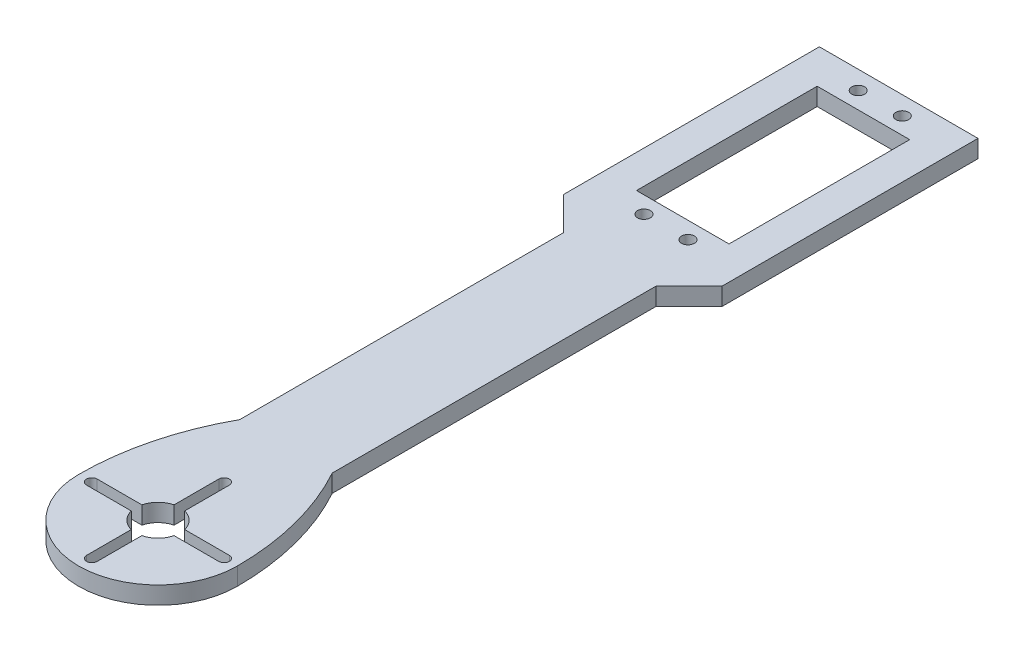
ISO-10303-21;
HEADER;
FILE_DESCRIPTION(('STEP AP214'),'2;1');
FILE_NAME('part.step','',(''),(''),'','','');
FILE_SCHEMA(('AUTOMOTIVE_DESIGN { 1 0 10303 214 1 1 1 1 }'));
ENDSEC;
DATA;
#1=APPLICATION_CONTEXT('core data for automotive mechanical design processes');
#2=APPLICATION_PROTOCOL_DEFINITION('international standard','automotive_design',2000,#1);
#3=PRODUCT_CONTEXT('',#1,'mechanical');
#4=PRODUCT('Part','Part','',(#3));
#5=PRODUCT_RELATED_PRODUCT_CATEGORY('part','',(#4));
#6=PRODUCT_DEFINITION_FORMATION('','',#4);
#7=PRODUCT_DEFINITION_CONTEXT('part definition',#1,'design');
#8=PRODUCT_DEFINITION('design','',#6,#7);
#9=PRODUCT_DEFINITION_SHAPE('','',#8);
#10=(LENGTH_UNIT() NAMED_UNIT(*) SI_UNIT(.MILLI.,.METRE.));
#11=(NAMED_UNIT(*) PLANE_ANGLE_UNIT() SI_UNIT($,.RADIAN.));
#12=(NAMED_UNIT(*) SI_UNIT($,.STERADIAN.) SOLID_ANGLE_UNIT());
#13=UNCERTAINTY_MEASURE_WITH_UNIT(LENGTH_MEASURE(1.E-05),#10,'distance_accuracy_value','');
#14=(GEOMETRIC_REPRESENTATION_CONTEXT(3) GLOBAL_UNCERTAINTY_ASSIGNED_CONTEXT((#13)) GLOBAL_UNIT_ASSIGNED_CONTEXT((#10,
#11,#12)) REPRESENTATION_CONTEXT('',''));
#15=CARTESIAN_POINT('',(0.,0.,0.));
#16=DIRECTION('',(0.,0.,1.));
#17=DIRECTION('',(1.,0.,0.));
#18=AXIS2_PLACEMENT_3D('',#15,#16,#17);
#19=CARTESIAN_POINT('',(0.,4.,0.));
#20=DIRECTION('',(0.,1.,0.));
#21=DIRECTION('',(0.,0.,1.));
#22=AXIS2_PLACEMENT_3D('',#19,#20,#21);
#23=PLANE('',#22);
#24=CARTESIAN_POINT('',(0.,4.,15.));
#25=DIRECTION('',(0.,1.,0.));
#26=DIRECTION('',(0.,0.,1.));
#27=AXIS2_PLACEMENT_3D('',#24,#25,#26);
#28=CIRCLE('',#27,1.19999999999999);
#29=CARTESIAN_POINT('',(-1.19999999999999,4.,15.));
#30=VERTEX_POINT('',#29);
#31=CARTESIAN_POINT('',(1.2,4.,15.));
#32=VERTEX_POINT('',#31);
#33=EDGE_CURVE('E335',#30,#32,#28,.T.);
#34=ORIENTED_EDGE('',*,*,#33,.F.);
#35=DIRECTION('',(0.,0.,1.));
#36=VECTOR('',#35,1.);
#37=CARTESIAN_POINT('',(-1.19999999999999,4.,0.));
#38=LINE('',#37,#36);
#39=CARTESIAN_POINT('',(-1.19999999999999,4.,4.85386443980464));
#40=VERTEX_POINT('',#39);
#41=EDGE_CURVE('E338',#40,#30,#38,.T.);
#42=ORIENTED_EDGE('',*,*,#41,.F.);
#43=CARTESIAN_POINT('',(0.,4.,0.));
#44=DIRECTION('',(0.,1.,0.));
#45=DIRECTION('',(0.,0.,1.));
#46=AXIS2_PLACEMENT_3D('',#43,#44,#45);
#47=CIRCLE('',#46,5.);
#48=CARTESIAN_POINT('',(-4.85386443980464,4.,1.2));
#49=VERTEX_POINT('',#48);
#50=EDGE_CURVE('E341',#49,#40,#47,.T.);
#51=ORIENTED_EDGE('',*,*,#50,.F.);
#52=DIRECTION('',(1.,0.,0.));
#53=VECTOR('',#52,1.);
#54=CARTESIAN_POINT('',(0.,4.,1.2));
#55=LINE('',#54,#53);
#56=CARTESIAN_POINT('',(-15.,4.,1.20000000000001));
#57=VERTEX_POINT('',#56);
#58=EDGE_CURVE('E345',#57,#49,#55,.T.);
#59=ORIENTED_EDGE('',*,*,#58,.F.);
#60=CARTESIAN_POINT('',(-15.,4.,0.));
#61=DIRECTION('',(0.,1.,0.));
#62=DIRECTION('',(0.,0.,1.));
#63=AXIS2_PLACEMENT_3D('',#60,#61,#62);
#64=CIRCLE('',#63,1.20000000000001);
#65=CARTESIAN_POINT('',(-15.,4.,-1.20000000000001));
#66=VERTEX_POINT('',#65);
#67=EDGE_CURVE('E350',#66,#57,#64,.T.);
#68=ORIENTED_EDGE('',*,*,#67,.F.);
#69=DIRECTION('',(1.,0.,0.));
#70=VECTOR('',#69,1.);
#71=CARTESIAN_POINT('',(0.,4.,-1.20000000000001));
#72=LINE('',#71,#70);
#73=CARTESIAN_POINT('',(-4.85386443980464,4.,-1.20000000000001));
#74=VERTEX_POINT('',#73);
#75=EDGE_CURVE('E354',#66,#74,#72,.T.);
#76=ORIENTED_EDGE('',*,*,#75,.T.);
#77=CARTESIAN_POINT('',(-1.2,4.,-4.85386443980464));
#78=VERTEX_POINT('',#77);
#79=EDGE_CURVE('E347',#78,#74,#47,.T.);
#80=ORIENTED_EDGE('',*,*,#79,.F.);
#81=CARTESIAN_POINT('',(-1.2,4.,-15.));
#82=VERTEX_POINT('',#81);
#83=EDGE_CURVE('E342',#82,#78,#38,.T.);
#84=ORIENTED_EDGE('',*,*,#83,.F.);
#85=CARTESIAN_POINT('',(0.,4.,-15.));
#86=DIRECTION('',(0.,1.,0.));
#87=DIRECTION('',(0.,0.,1.));
#88=AXIS2_PLACEMENT_3D('',#85,#86,#87);
#89=CIRCLE('',#88,1.19999999999999);
#90=CARTESIAN_POINT('',(1.19999999999999,4.,-15.));
#91=VERTEX_POINT('',#90);
#92=EDGE_CURVE('E357',#91,#82,#89,.T.);
#93=ORIENTED_EDGE('',*,*,#92,.F.);
#94=DIRECTION('',(0.,0.,1.));
#95=VECTOR('',#94,1.);
#96=CARTESIAN_POINT('',(1.19999999999999,4.,0.));
#97=LINE('',#96,#95);
#98=CARTESIAN_POINT('',(1.19999999999999,4.,-4.85386443980464));
#99=VERTEX_POINT('',#98);
#100=EDGE_CURVE('E360',#91,#99,#97,.T.);
#101=ORIENTED_EDGE('',*,*,#100,.T.);
#102=CARTESIAN_POINT('',(4.85386443980464,4.,-1.20000000000001));
#103=VERTEX_POINT('',#102);
#104=EDGE_CURVE('E362',#103,#99,#47,.T.);
#105=ORIENTED_EDGE('',*,*,#104,.F.);
#106=CARTESIAN_POINT('',(15.,4.,-1.20000000000001));
#107=VERTEX_POINT('',#106);
#108=EDGE_CURVE('E356',#103,#107,#72,.T.);
#109=ORIENTED_EDGE('',*,*,#108,.T.);
#110=CARTESIAN_POINT('',(15.,4.,0.));
#111=DIRECTION('',(0.,1.,0.));
#112=DIRECTION('',(0.,0.,1.));
#113=AXIS2_PLACEMENT_3D('',#110,#111,#112);
#114=CIRCLE('',#113,1.20000000000001);
#115=CARTESIAN_POINT('',(15.,4.,1.2));
#116=VERTEX_POINT('',#115);
#117=EDGE_CURVE('E364',#116,#107,#114,.T.);
#118=ORIENTED_EDGE('',*,*,#117,.F.);
#119=CARTESIAN_POINT('',(4.85386443980464,4.,1.2));
#120=VERTEX_POINT('',#119);
#121=EDGE_CURVE('E351',#120,#116,#55,.T.);
#122=ORIENTED_EDGE('',*,*,#121,.F.);
#123=CARTESIAN_POINT('',(1.19999999999999,4.,4.85386443980464));
#124=VERTEX_POINT('',#123);
#125=EDGE_CURVE('E346',#124,#120,#47,.T.);
#126=ORIENTED_EDGE('',*,*,#125,.F.);
#127=EDGE_CURVE('E363',#124,#32,#97,.T.);
#128=ORIENTED_EDGE('',*,*,#127,.T.);
#129=EDGE_LOOP('',(#34,#42,#51,#59,#68,#76,#80,#84,#93,#101,#105,#109,#118,#122,#126,#128));
#130=FACE_BOUND('',#129,.T.);
#131=CARTESIAN_POINT('',(5.,4.,-115.28));
#132=DIRECTION('',(0.,1.,0.));
#133=DIRECTION('',(0.,0.,1.));
#134=AXIS2_PLACEMENT_3D('',#131,#132,#133);
#135=CIRCLE('',#134,1.45000000000001);
#136=CARTESIAN_POINT('',(5.,4.,-113.83));
#137=VERTEX_POINT('',#136);
#138=EDGE_CURVE('E332',#137,#137,#135,.T.);
#139=ORIENTED_EDGE('',*,*,#138,.F.);
#140=EDGE_LOOP('',(#139));
#141=FACE_BOUND('',#140,.T.);
#142=CARTESIAN_POINT('',(-5.,4.,-115.28));
#143=DIRECTION('',(0.,1.,0.));
#144=DIRECTION('',(0.,0.,1.));
#145=AXIS2_PLACEMENT_3D('',#142,#143,#144);
#146=CIRCLE('',#145,1.45000000000001);
#147=CARTESIAN_POINT('',(-5.,4.,-113.83));
#148=VERTEX_POINT('',#147);
#149=EDGE_CURVE('E329',#148,#148,#146,.T.);
#150=ORIENTED_EDGE('',*,*,#149,.F.);
#151=EDGE_LOOP('',(#150));
#152=FACE_BOUND('',#151,.T.);
#153=CARTESIAN_POINT('',(5.,4.,-163.91));
#154=DIRECTION('',(0.,1.,0.));
#155=DIRECTION('',(0.,0.,1.));
#156=AXIS2_PLACEMENT_3D('',#153,#154,#155);
#157=CIRCLE('',#156,1.45000000000001);
#158=CARTESIAN_POINT('',(5.,4.,-162.46));
#159=VERTEX_POINT('',#158);
#160=EDGE_CURVE('E326',#159,#159,#157,.T.);
#161=ORIENTED_EDGE('',*,*,#160,.F.);
#162=EDGE_LOOP('',(#161));
#163=FACE_BOUND('',#162,.T.);
#164=CARTESIAN_POINT('',(-5.,4.,-163.91));
#165=DIRECTION('',(0.,1.,0.));
#166=DIRECTION('',(0.,0.,1.));
#167=AXIS2_PLACEMENT_3D('',#164,#165,#166);
#168=CIRCLE('',#167,1.45000000000001);
#169=CARTESIAN_POINT('',(-5.,4.,-162.46));
#170=VERTEX_POINT('',#169);
#171=EDGE_CURVE('E323',#170,#170,#168,.T.);
#172=ORIENTED_EDGE('',*,*,#171,.F.);
#173=EDGE_LOOP('',(#172));
#174=FACE_BOUND('',#173,.T.);
#175=DIRECTION('',(1.,0.,0.));
#176=VECTOR('',#175,1.);
#177=CARTESIAN_POINT('',(0.,4.,-160.095));
#178=LINE('',#177,#176);
#179=CARTESIAN_POINT('',(-10.5,4.,-160.095));
#180=VERTEX_POINT('',#179);
#181=CARTESIAN_POINT('',(10.5,4.,-160.095));
#182=VERTEX_POINT('',#181);
#183=EDGE_CURVE('E311',#180,#182,#178,.T.);
#184=ORIENTED_EDGE('',*,*,#183,.T.);
#185=DIRECTION('',(0.,0.,1.));
#186=VECTOR('',#185,1.);
#187=CARTESIAN_POINT('',(10.5,4.,0.));
#188=LINE('',#187,#186);
#189=CARTESIAN_POINT('',(10.5,4.,-119.095));
#190=VERTEX_POINT('',#189);
#191=EDGE_CURVE('E314',#182,#190,#188,.T.);
#192=ORIENTED_EDGE('',*,*,#191,.T.);
#193=DIRECTION('',(1.,0.,0.));
#194=VECTOR('',#193,1.);
#195=CARTESIAN_POINT('',(0.,4.,-119.095));
#196=LINE('',#195,#194);
#197=CARTESIAN_POINT('',(-10.5,4.,-119.095));
#198=VERTEX_POINT('',#197);
#199=EDGE_CURVE('E317',#198,#190,#196,.T.);
#200=ORIENTED_EDGE('',*,*,#199,.F.);
#201=DIRECTION('',(0.,0.,1.));
#202=VECTOR('',#201,1.);
#203=CARTESIAN_POINT('',(-10.5,4.,0.));
#204=LINE('',#203,#202);
#205=EDGE_CURVE('E320',#180,#198,#204,.T.);
#206=ORIENTED_EDGE('',*,*,#205,.F.);
#207=EDGE_LOOP('',(#184,#192,#200,#206));
#208=FACE_BOUND('',#207,.T.);
#209=CARTESIAN_POINT('',(0.,4.,0.));
#210=DIRECTION('',(0.,1.,0.));
#211=DIRECTION('',(0.,0.,1.));
#212=AXIS2_PLACEMENT_3D('',#209,#210,#211);
#213=CIRCLE('',#212,18.);
#214=CARTESIAN_POINT('',(-18.,4.,0.));
#215=VERTEX_POINT('',#214);
#216=CARTESIAN_POINT('',(18.,4.,0.));
#217=VERTEX_POINT('',#216);
#218=EDGE_CURVE('E370',#215,#217,#213,.T.);
#219=ORIENTED_EDGE('',*,*,#218,.T.);
#220=CARTESIAN_POINT('',(-42.,4.,0.));
#221=DIRECTION('',(0.,1.,0.));
#222=DIRECTION('',(0.,0.,-1.));
#223=AXIS2_PLACEMENT_3D('',#220,#221,#222);
#224=CIRCLE('',#223,60.);
#225=CARTESIAN_POINT('',(10.5,4.,-29.0473750965556));
#226=VERTEX_POINT('',#225);
#227=EDGE_CURVE('E269',#217,#226,#224,.T.);
#228=ORIENTED_EDGE('',*,*,#227,.T.);
#229=DIRECTION('',(0.,0.,-1.));
#230=VECTOR('',#229,1.);
#231=CARTESIAN_POINT('',(10.5,4.,-102.5));
#232=LINE('',#231,#230);
#233=CARTESIAN_POINT('',(10.5,4.,-102.5));
#234=VERTEX_POINT('',#233);
#235=EDGE_CURVE('E276',#226,#234,#232,.T.);
#236=ORIENTED_EDGE('',*,*,#235,.T.);
#237=DIRECTION('',(0.707106781186549,0.,-0.707106781186546));
#238=VECTOR('',#237,1.);
#239=CARTESIAN_POINT('',(18.,4.,-110.));
#240=LINE('',#239,#238);
#241=CARTESIAN_POINT('',(18.,4.,-110.));
#242=VERTEX_POINT('',#241);
#243=EDGE_CURVE('E252',#234,#242,#240,.T.);
#244=ORIENTED_EDGE('',*,*,#243,.T.);
#245=DIRECTION('',(0.,0.,-1.));
#246=VECTOR('',#245,1.);
#247=CARTESIAN_POINT('',(18.,4.,0.));
#248=LINE('',#247,#246);
#249=CARTESIAN_POINT('',(18.,4.,-168.095));
#250=VERTEX_POINT('',#249);
#251=EDGE_CURVE('E373',#242,#250,#248,.T.);
#252=ORIENTED_EDGE('',*,*,#251,.T.);
#253=DIRECTION('',(-1.,0.,0.));
#254=VECTOR('',#253,1.);
#255=CARTESIAN_POINT('',(0.,4.,-168.095));
#256=LINE('',#255,#254);
#257=CARTESIAN_POINT('',(-18.,4.,-168.095));
#258=VERTEX_POINT('',#257);
#259=EDGE_CURVE('E375',#250,#258,#256,.T.);
#260=ORIENTED_EDGE('',*,*,#259,.T.);
#261=DIRECTION('',(0.,0.,1.));
#262=VECTOR('',#261,1.);
#263=CARTESIAN_POINT('',(-18.,4.,0.));
#264=LINE('',#263,#262);
#265=CARTESIAN_POINT('',(-18.,4.,-110.));
#266=VERTEX_POINT('',#265);
#267=EDGE_CURVE('E367',#258,#266,#264,.T.);
#268=ORIENTED_EDGE('',*,*,#267,.T.);
#269=DIRECTION('',(-0.707106781186549,0.,-0.707106781186546));
#270=VECTOR('',#269,1.);
#271=CARTESIAN_POINT('',(-18.,4.,-110.));
#272=LINE('',#271,#270);
#273=CARTESIAN_POINT('',(-10.5,4.,-102.5));
#274=VERTEX_POINT('',#273);
#275=EDGE_CURVE('E291',#274,#266,#272,.T.);
#276=ORIENTED_EDGE('',*,*,#275,.F.);
#277=DIRECTION('',(0.,0.,-1.));
#278=VECTOR('',#277,1.);
#279=CARTESIAN_POINT('',(-10.5,4.,-102.5));
#280=LINE('',#279,#278);
#281=CARTESIAN_POINT('',(-10.5,4.,-29.0473750965556));
#282=VERTEX_POINT('',#281);
#283=EDGE_CURVE('E300',#282,#274,#280,.T.);
#284=ORIENTED_EDGE('',*,*,#283,.F.);
#285=CARTESIAN_POINT('',(42.,4.,0.));
#286=DIRECTION('',(0.,-1.,0.));
#287=DIRECTION('',(0.,0.,-1.));
#288=AXIS2_PLACEMENT_3D('',#285,#286,#287);
#289=CIRCLE('',#288,60.);
#290=EDGE_CURVE('E283',#215,#282,#289,.T.);
#291=ORIENTED_EDGE('',*,*,#290,.F.);
#292=EDGE_LOOP('',(#219,#228,#236,#244,#252,#260,#268,#276,#284,#291));
#293=FACE_BOUND('',#292,.T.);
#294=ADVANCED_FACE('F37',(#130,#141,#152,#163,#174,#208,#293),#23,.T.);
#295=CARTESIAN_POINT('',(0.,0.,0.));
#296=DIRECTION('',(0.,1.,0.));
#297=DIRECTION('',(0.,0.,1.));
#298=AXIS2_PLACEMENT_3D('',#295,#296,#297);
#299=PLANE('',#298);
#300=DIRECTION('',(-1.,0.,0.));
#301=VECTOR('',#300,1.);
#302=CARTESIAN_POINT('',(2.,0.,-25.));
#303=LINE('',#302,#301);
#304=CARTESIAN_POINT('',(2.,0.,-25.));
#305=VERTEX_POINT('',#304);
#306=CARTESIAN_POINT('',(-2.,0.,-25.));
#307=VERTEX_POINT('',#306);
#308=EDGE_CURVE('E59',#305,#307,#303,.T.);
#309=ORIENTED_EDGE('',*,*,#308,.F.);
#310=DIRECTION('',(0.,0.,1.));
#311=VECTOR('',#310,1.);
#312=CARTESIAN_POINT('',(2.,0.,-25.));
#313=LINE('',#312,#311);
#314=CARTESIAN_POINT('',(2.,0.,-105.));
#315=VERTEX_POINT('',#314);
#316=EDGE_CURVE('E54',#315,#305,#313,.T.);
#317=ORIENTED_EDGE('',*,*,#316,.F.);
#318=DIRECTION('',(-1.,0.,0.));
#319=VECTOR('',#318,1.);
#320=CARTESIAN_POINT('',(2.,0.,-105.));
#321=LINE('',#320,#319);
#322=CARTESIAN_POINT('',(-2.,0.,-105.));
#323=VERTEX_POINT('',#322);
#324=EDGE_CURVE('E244',#315,#323,#321,.T.);
#325=ORIENTED_EDGE('',*,*,#324,.T.);
#326=DIRECTION('',(0.,0.,1.));
#327=VECTOR('',#326,1.);
#328=CARTESIAN_POINT('',(-2.,0.,-25.));
#329=LINE('',#328,#327);
#330=EDGE_CURVE('E248',#323,#307,#329,.T.);
#331=ORIENTED_EDGE('',*,*,#330,.T.);
#332=EDGE_LOOP('',(#309,#317,#325,#331));
#333=FACE_BOUND('',#332,.T.);
#334=CARTESIAN_POINT('',(0.,0.,15.));
#335=DIRECTION('',(0.,1.,0.));
#336=DIRECTION('',(0.,0.,1.));
#337=AXIS2_PLACEMENT_3D('',#334,#335,#336);
#338=CIRCLE('',#337,1.19999999999999);
#339=CARTESIAN_POINT('',(-1.19999999999999,0.,15.));
#340=VERTEX_POINT('',#339);
#341=CARTESIAN_POINT('',(1.2,0.,15.));
#342=VERTEX_POINT('',#341);
#343=EDGE_CURVE('E401',#340,#342,#338,.T.);
#344=ORIENTED_EDGE('',*,*,#343,.T.);
#345=DIRECTION('',(0.,0.,1.));
#346=VECTOR('',#345,1.);
#347=CARTESIAN_POINT('',(1.19999999999999,0.,0.));
#348=LINE('',#347,#346);
#349=CARTESIAN_POINT('',(1.19999999999999,0.,4.85386443980464));
#350=VERTEX_POINT('',#349);
#351=EDGE_CURVE('E431',#350,#342,#348,.T.);
#352=ORIENTED_EDGE('',*,*,#351,.F.);
#353=CARTESIAN_POINT('',(0.,0.,0.));
#354=DIRECTION('',(0.,1.,0.));
#355=DIRECTION('',(0.,0.,1.));
#356=AXIS2_PLACEMENT_3D('',#353,#354,#355);
#357=CIRCLE('',#356,5.);
#358=CARTESIAN_POINT('',(4.85386443980464,0.,1.2));
#359=VERTEX_POINT('',#358);
#360=EDGE_CURVE('E412',#350,#359,#357,.T.);
#361=ORIENTED_EDGE('',*,*,#360,.T.);
#362=DIRECTION('',(1.,0.,0.));
#363=VECTOR('',#362,1.);
#364=CARTESIAN_POINT('',(0.,0.,1.2));
#365=LINE('',#364,#363);
#366=CARTESIAN_POINT('',(15.,0.,1.2));
#367=VERTEX_POINT('',#366);
#368=EDGE_CURVE('E417',#359,#367,#365,.T.);
#369=ORIENTED_EDGE('',*,*,#368,.T.);
#370=CARTESIAN_POINT('',(15.,0.,0.));
#371=DIRECTION('',(0.,1.,0.));
#372=DIRECTION('',(0.,0.,1.));
#373=AXIS2_PLACEMENT_3D('',#370,#371,#372);
#374=CIRCLE('',#373,1.20000000000001);
#375=CARTESIAN_POINT('',(15.,0.,-1.20000000000001));
#376=VERTEX_POINT('',#375);
#377=EDGE_CURVE('E432',#367,#376,#374,.T.);
#378=ORIENTED_EDGE('',*,*,#377,.T.);
#379=DIRECTION('',(1.,0.,0.));
#380=VECTOR('',#379,1.);
#381=CARTESIAN_POINT('',(0.,0.,-1.20000000000001));
#382=LINE('',#381,#380);
#383=CARTESIAN_POINT('',(4.85386443980464,0.,-1.20000000000001));
#384=VERTEX_POINT('',#383);
#385=EDGE_CURVE('E423',#384,#376,#382,.T.);
#386=ORIENTED_EDGE('',*,*,#385,.F.);
#387=CARTESIAN_POINT('',(1.19999999999999,0.,-4.85386443980464));
#388=VERTEX_POINT('',#387);
#389=EDGE_CURVE('E430',#384,#388,#357,.T.);
#390=ORIENTED_EDGE('',*,*,#389,.T.);
#391=CARTESIAN_POINT('',(1.19999999999999,0.,-15.));
#392=VERTEX_POINT('',#391);
#393=EDGE_CURVE('E427',#392,#388,#348,.T.);
#394=ORIENTED_EDGE('',*,*,#393,.F.);
#395=CARTESIAN_POINT('',(0.,0.,-15.));
#396=DIRECTION('',(0.,1.,0.));
#397=DIRECTION('',(0.,0.,1.));
#398=AXIS2_PLACEMENT_3D('',#395,#396,#397);
#399=CIRCLE('',#398,1.19999999999999);
#400=CARTESIAN_POINT('',(-1.2,0.,-15.));
#401=VERTEX_POINT('',#400);
#402=EDGE_CURVE('E424',#392,#401,#399,.T.);
#403=ORIENTED_EDGE('',*,*,#402,.T.);
#404=DIRECTION('',(0.,0.,1.));
#405=VECTOR('',#404,1.);
#406=CARTESIAN_POINT('',(-1.19999999999999,0.,0.));
#407=LINE('',#406,#405);
#408=CARTESIAN_POINT('',(-1.2,0.,-4.85386443980464));
#409=VERTEX_POINT('',#408);
#410=EDGE_CURVE('E408',#401,#409,#407,.T.);
#411=ORIENTED_EDGE('',*,*,#410,.T.);
#412=CARTESIAN_POINT('',(-4.85386443980464,0.,-1.20000000000001));
#413=VERTEX_POINT('',#412);
#414=EDGE_CURVE('E413',#409,#413,#357,.T.);
#415=ORIENTED_EDGE('',*,*,#414,.T.);
#416=CARTESIAN_POINT('',(-15.,0.,-1.20000000000001));
#417=VERTEX_POINT('',#416);
#418=EDGE_CURVE('E420',#417,#413,#382,.T.);
#419=ORIENTED_EDGE('',*,*,#418,.F.);
#420=CARTESIAN_POINT('',(-15.,0.,0.));
#421=DIRECTION('',(0.,1.,0.));
#422=DIRECTION('',(0.,0.,1.));
#423=AXIS2_PLACEMENT_3D('',#420,#421,#422);
#424=CIRCLE('',#423,1.20000000000001);
#425=CARTESIAN_POINT('',(-15.,0.,1.20000000000001));
#426=VERTEX_POINT('',#425);
#427=EDGE_CURVE('E416',#417,#426,#424,.T.);
#428=ORIENTED_EDGE('',*,*,#427,.T.);
#429=CARTESIAN_POINT('',(-4.85386443980464,0.,1.2));
#430=VERTEX_POINT('',#429);
#431=EDGE_CURVE('E411',#426,#430,#365,.T.);
#432=ORIENTED_EDGE('',*,*,#431,.T.);
#433=CARTESIAN_POINT('',(-1.19999999999999,0.,4.85386443980464));
#434=VERTEX_POINT('',#433);
#435=EDGE_CURVE('E407',#430,#434,#357,.T.);
#436=ORIENTED_EDGE('',*,*,#435,.T.);
#437=EDGE_CURVE('E404',#434,#340,#407,.T.);
#438=ORIENTED_EDGE('',*,*,#437,.T.);
#439=EDGE_LOOP('',(#344,#352,#361,#369,#378,#386,#390,#394,#403,#411,#415,#419,#428,#432,#436,#438));
#440=FACE_BOUND('',#439,.T.);
#441=CARTESIAN_POINT('',(5.,0.,-115.28));
#442=DIRECTION('',(0.,1.,0.));
#443=DIRECTION('',(0.,0.,1.));
#444=AXIS2_PLACEMENT_3D('',#441,#442,#443);
#445=CIRCLE('',#444,1.45000000000001);
#446=CARTESIAN_POINT('',(5.,0.,-113.83));
#447=VERTEX_POINT('',#446);
#448=EDGE_CURVE('E398',#447,#447,#445,.T.);
#449=ORIENTED_EDGE('',*,*,#448,.T.);
#450=EDGE_LOOP('',(#449));
#451=FACE_BOUND('',#450,.T.);
#452=CARTESIAN_POINT('',(-5.,0.,-115.28));
#453=DIRECTION('',(0.,1.,0.));
#454=DIRECTION('',(0.,0.,1.));
#455=AXIS2_PLACEMENT_3D('',#452,#453,#454);
#456=CIRCLE('',#455,1.45000000000001);
#457=CARTESIAN_POINT('',(-5.,0.,-113.83));
#458=VERTEX_POINT('',#457);
#459=EDGE_CURVE('E395',#458,#458,#456,.T.);
#460=ORIENTED_EDGE('',*,*,#459,.T.);
#461=EDGE_LOOP('',(#460));
#462=FACE_BOUND('',#461,.T.);
#463=CARTESIAN_POINT('',(5.,0.,-163.91));
#464=DIRECTION('',(0.,1.,0.));
#465=DIRECTION('',(0.,0.,1.));
#466=AXIS2_PLACEMENT_3D('',#463,#464,#465);
#467=CIRCLE('',#466,1.45000000000001);
#468=CARTESIAN_POINT('',(5.,0.,-162.46));
#469=VERTEX_POINT('',#468);
#470=EDGE_CURVE('E392',#469,#469,#467,.T.);
#471=ORIENTED_EDGE('',*,*,#470,.T.);
#472=EDGE_LOOP('',(#471));
#473=FACE_BOUND('',#472,.T.);
#474=CARTESIAN_POINT('',(-5.,0.,-163.91));
#475=DIRECTION('',(0.,1.,0.));
#476=DIRECTION('',(0.,0.,1.));
#477=AXIS2_PLACEMENT_3D('',#474,#475,#476);
#478=CIRCLE('',#477,1.45000000000001);
#479=CARTESIAN_POINT('',(-5.,0.,-162.46));
#480=VERTEX_POINT('',#479);
#481=EDGE_CURVE('E389',#480,#480,#478,.T.);
#482=ORIENTED_EDGE('',*,*,#481,.T.);
#483=EDGE_LOOP('',(#482));
#484=FACE_BOUND('',#483,.T.);
#485=DIRECTION('',(1.,0.,0.));
#486=VECTOR('',#485,1.);
#487=CARTESIAN_POINT('',(0.,0.,-160.095));
#488=LINE('',#487,#486);
#489=CARTESIAN_POINT('',(-10.5,0.,-160.095));
#490=VERTEX_POINT('',#489);
#491=CARTESIAN_POINT('',(10.5,0.,-160.095));
#492=VERTEX_POINT('',#491);
#493=EDGE_CURVE('E307',#490,#492,#488,.T.);
#494=ORIENTED_EDGE('',*,*,#493,.F.);
#495=DIRECTION('',(0.,0.,1.));
#496=VECTOR('',#495,1.);
#497=CARTESIAN_POINT('',(-10.5,0.,0.));
#498=LINE('',#497,#496);
#499=CARTESIAN_POINT('',(-10.5,0.,-119.095));
#500=VERTEX_POINT('',#499);
#501=EDGE_CURVE('E386',#490,#500,#498,.T.);
#502=ORIENTED_EDGE('',*,*,#501,.T.);
#503=DIRECTION('',(1.,0.,0.));
#504=VECTOR('',#503,1.);
#505=CARTESIAN_POINT('',(0.,0.,-119.095));
#506=LINE('',#505,#504);
#507=CARTESIAN_POINT('',(10.5,0.,-119.095));
#508=VERTEX_POINT('',#507);
#509=EDGE_CURVE('E383',#500,#508,#506,.T.);
#510=ORIENTED_EDGE('',*,*,#509,.T.);
#511=DIRECTION('',(0.,0.,1.));
#512=VECTOR('',#511,1.);
#513=CARTESIAN_POINT('',(10.5,0.,0.));
#514=LINE('',#513,#512);
#515=EDGE_CURVE('E380',#492,#508,#514,.T.);
#516=ORIENTED_EDGE('',*,*,#515,.F.);
#517=EDGE_LOOP('',(#494,#502,#510,#516));
#518=FACE_BOUND('',#517,.T.);
#519=CARTESIAN_POINT('',(-42.,0.,0.));
#520=DIRECTION('',(0.,1.,0.));
#521=DIRECTION('',(0.,0.,-1.));
#522=AXIS2_PLACEMENT_3D('',#519,#520,#521);
#523=CIRCLE('',#522,60.);
#524=CARTESIAN_POINT('',(18.,0.,0.));
#525=VERTEX_POINT('',#524);
#526=CARTESIAN_POINT('',(10.5,0.,-29.0473750965556));
#527=VERTEX_POINT('',#526);
#528=EDGE_CURVE('E271',#525,#527,#523,.T.);
#529=ORIENTED_EDGE('',*,*,#528,.F.);
#530=CARTESIAN_POINT('',(0.,0.,0.));
#531=DIRECTION('',(0.,1.,0.));
#532=DIRECTION('',(0.,0.,1.));
#533=AXIS2_PLACEMENT_3D('',#530,#531,#532);
#534=CIRCLE('',#533,18.);
#535=CARTESIAN_POINT('',(-18.,0.,0.));
#536=VERTEX_POINT('',#535);
#537=EDGE_CURVE('E438',#536,#525,#534,.T.);
#538=ORIENTED_EDGE('',*,*,#537,.F.);
#539=CARTESIAN_POINT('',(42.,0.,0.));
#540=DIRECTION('',(0.,-1.,0.));
#541=DIRECTION('',(0.,0.,-1.));
#542=AXIS2_PLACEMENT_3D('',#539,#540,#541);
#543=CIRCLE('',#542,60.);
#544=CARTESIAN_POINT('',(-10.5,0.,-29.0473750965556));
#545=VERTEX_POINT('',#544);
#546=EDGE_CURVE('E287',#536,#545,#543,.T.);
#547=ORIENTED_EDGE('',*,*,#546,.T.);
#548=DIRECTION('',(0.,0.,-1.));
#549=VECTOR('',#548,1.);
#550=CARTESIAN_POINT('',(-10.5,0.,-102.5));
#551=LINE('',#550,#549);
#552=CARTESIAN_POINT('',(-10.5,0.,-102.5));
#553=VERTEX_POINT('',#552);
#554=EDGE_CURVE('E290',#545,#553,#551,.T.);
#555=ORIENTED_EDGE('',*,*,#554,.T.);
#556=DIRECTION('',(-0.707106781186549,0.,-0.707106781186546));
#557=VECTOR('',#556,1.);
#558=CARTESIAN_POINT('',(-18.,0.,-110.));
#559=LINE('',#558,#557);
#560=CARTESIAN_POINT('',(-18.,0.,-110.));
#561=VERTEX_POINT('',#560);
#562=EDGE_CURVE('E294',#553,#561,#559,.T.);
#563=ORIENTED_EDGE('',*,*,#562,.T.);
#564=DIRECTION('',(0.,0.,1.));
#565=VECTOR('',#564,1.);
#566=CARTESIAN_POINT('',(-18.,0.,0.));
#567=LINE('',#566,#565);
#568=CARTESIAN_POINT('',(-18.,0.,-168.095));
#569=VERTEX_POINT('',#568);
#570=EDGE_CURVE('E435',#569,#561,#567,.T.);
#571=ORIENTED_EDGE('',*,*,#570,.F.);
#572=DIRECTION('',(-1.,0.,0.));
#573=VECTOR('',#572,1.);
#574=CARTESIAN_POINT('',(0.,0.,-168.095));
#575=LINE('',#574,#573);
#576=CARTESIAN_POINT('',(18.,0.,-168.095));
#577=VERTEX_POINT('',#576);
#578=EDGE_CURVE('E315',#577,#569,#575,.T.);
#579=ORIENTED_EDGE('',*,*,#578,.F.);
#580=DIRECTION('',(0.,0.,-1.));
#581=VECTOR('',#580,1.);
#582=CARTESIAN_POINT('',(18.,0.,0.));
#583=LINE('',#582,#581);
#584=CARTESIAN_POINT('',(18.,0.,-110.));
#585=VERTEX_POINT('',#584);
#586=EDGE_CURVE('E441',#585,#577,#583,.T.);
#587=ORIENTED_EDGE('',*,*,#586,.F.);
#588=DIRECTION('',(0.707106781186549,0.,-0.707106781186546));
#589=VECTOR('',#588,1.);
#590=CARTESIAN_POINT('',(18.,0.,-110.));
#591=LINE('',#590,#589);
#592=CARTESIAN_POINT('',(10.5,0.,-102.5));
#593=VERTEX_POINT('',#592);
#594=EDGE_CURVE('E266',#593,#585,#591,.T.);
#595=ORIENTED_EDGE('',*,*,#594,.F.);
#596=DIRECTION('',(0.,0.,-1.));
#597=VECTOR('',#596,1.);
#598=CARTESIAN_POINT('',(10.5,0.,-102.5));
#599=LINE('',#598,#597);
#600=EDGE_CURVE('E268',#527,#593,#599,.T.);
#601=ORIENTED_EDGE('',*,*,#600,.F.);
#602=EDGE_LOOP('',(#529,#538,#547,#555,#563,#571,#579,#587,#595,#601));
#603=FACE_BOUND('',#602,.T.);
#604=ADVANCED_FACE('F246',(#333,#440,#451,#462,#473,#484,#518,#603),#299,.F.);
#605=CARTESIAN_POINT('',(18.,4.,0.));
#606=DIRECTION('',(-1.,0.,0.));
#607=DIRECTION('',(0.,0.,1.));
#608=AXIS2_PLACEMENT_3D('',#605,#606,#607);
#609=PLANE('',#608);
#610=DIRECTION('',(0.,1.,0.));
#611=VECTOR('',#610,1.);
#612=CARTESIAN_POINT('',(18.,0.,-110.));
#613=LINE('',#612,#611);
#614=EDGE_CURVE('E273',#585,#242,#613,.T.);
#615=ORIENTED_EDGE('',*,*,#614,.F.);
#616=ORIENTED_EDGE('',*,*,#586,.T.);
#617=DIRECTION('',(0.,-1.,0.));
#618=VECTOR('',#617,1.);
#619=CARTESIAN_POINT('',(18.,4.,-168.095));
#620=LINE('',#619,#618);
#621=EDGE_CURVE('E447',#250,#577,#620,.T.);
#622=ORIENTED_EDGE('',*,*,#621,.F.);
#623=ORIENTED_EDGE('',*,*,#251,.F.);
#624=EDGE_LOOP('',(#615,#616,#622,#623));
#625=FACE_BOUND('',#624,.T.);
#626=ADVANCED_FACE('F524',(#625),#609,.F.);
#627=CARTESIAN_POINT('',(-18.,4.,0.));
#628=DIRECTION('',(1.,0.,0.));
#629=DIRECTION('',(0.,0.,-1.));
#630=AXIS2_PLACEMENT_3D('',#627,#628,#629);
#631=PLANE('',#630);
#632=ORIENTED_EDGE('',*,*,#570,.T.);
#633=DIRECTION('',(0.,1.,0.));
#634=VECTOR('',#633,1.);
#635=CARTESIAN_POINT('',(-18.,0.,-110.));
#636=LINE('',#635,#634);
#637=EDGE_CURVE('E304',#561,#266,#636,.T.);
#638=ORIENTED_EDGE('',*,*,#637,.T.);
#639=ORIENTED_EDGE('',*,*,#267,.F.);
#640=DIRECTION('',(0.,-1.,0.));
#641=VECTOR('',#640,1.);
#642=CARTESIAN_POINT('',(-18.,4.,-168.095));
#643=LINE('',#642,#641);
#644=EDGE_CURVE('E444',#258,#569,#643,.T.);
#645=ORIENTED_EDGE('',*,*,#644,.T.);
#646=EDGE_LOOP('',(#632,#638,#639,#645));
#647=FACE_BOUND('',#646,.T.);
#648=ADVANCED_FACE('F538',(#647),#631,.F.);
#649=CARTESIAN_POINT('',(0.,4.,0.));
#650=DIRECTION('',(0.,-1.,0.));
#651=DIRECTION('',(0.,0.,-1.));
#652=AXIS2_PLACEMENT_3D('',#649,#650,#651);
#653=CYLINDRICAL_SURFACE('',#652,18.);
#654=ORIENTED_EDGE('',*,*,#537,.T.);
#655=DIRECTION('',(0.,-1.,0.));
#656=VECTOR('',#655,1.);
#657=CARTESIAN_POINT('',(18.,4.,0.));
#658=LINE('',#657,#656);
#659=EDGE_CURVE('E46',#217,#525,#658,.T.);
#660=ORIENTED_EDGE('',*,*,#659,.F.);
#661=ORIENTED_EDGE('',*,*,#218,.F.);
#662=DIRECTION('',(0.,-1.,0.));
#663=VECTOR('',#662,1.);
#664=CARTESIAN_POINT('',(-18.,4.,0.));
#665=LINE('',#664,#663);
#666=EDGE_CURVE('E11',#215,#536,#665,.T.);
#667=ORIENTED_EDGE('',*,*,#666,.T.);
#668=EDGE_LOOP('',(#654,#660,#661,#667));
#669=FACE_BOUND('',#668,.T.);
#670=ADVANCED_FACE('F540',(#669),#653,.T.);
#671=CARTESIAN_POINT('',(0.,4.,15.));
#672=DIRECTION('',(0.,-1.,0.));
#673=DIRECTION('',(0.,0.,-1.));
#674=AXIS2_PLACEMENT_3D('',#671,#672,#673);
#675=CYLINDRICAL_SURFACE('',#674,1.19999999999999);
#676=ORIENTED_EDGE('',*,*,#343,.F.);
#677=DIRECTION('',(0.,-1.,0.));
#678=VECTOR('',#677,1.);
#679=CARTESIAN_POINT('',(-1.19999999999999,4.,15.));
#680=LINE('',#679,#678);
#681=EDGE_CURVE('E448',#30,#340,#680,.T.);
#682=ORIENTED_EDGE('',*,*,#681,.F.);
#683=ORIENTED_EDGE('',*,*,#33,.T.);
#684=DIRECTION('',(0.,-1.,0.));
#685=VECTOR('',#684,1.);
#686=CARTESIAN_POINT('',(1.2,4.,15.));
#687=LINE('',#686,#685);
#688=EDGE_CURVE('E452',#32,#342,#687,.T.);
#689=ORIENTED_EDGE('',*,*,#688,.T.);
#690=EDGE_LOOP('',(#676,#682,#683,#689));
#691=FACE_BOUND('',#690,.T.);
#692=ADVANCED_FACE('F543',(#691),#675,.F.);
#693=CARTESIAN_POINT('',(-1.19999999999999,4.,0.));
#694=DIRECTION('',(1.,0.,0.));
#695=DIRECTION('',(0.,0.,-1.));
#696=AXIS2_PLACEMENT_3D('',#693,#694,#695);
#697=PLANE('',#696);
#698=ORIENTED_EDGE('',*,*,#437,.F.);
#699=DIRECTION('',(0.,-1.,0.));
#700=VECTOR('',#699,1.);
#701=CARTESIAN_POINT('',(-1.19999999999999,4.,4.85386443980464));
#702=LINE('',#701,#700);
#703=EDGE_CURVE('E480',#40,#434,#702,.T.);
#704=ORIENTED_EDGE('',*,*,#703,.F.);
#705=ORIENTED_EDGE('',*,*,#41,.T.);
#706=ORIENTED_EDGE('',*,*,#681,.T.);
#707=EDGE_LOOP('',(#698,#704,#705,#706));
#708=FACE_BOUND('',#707,.T.);
#709=ADVANCED_FACE('F577',(#708),#697,.T.);
#710=CARTESIAN_POINT('',(0.,4.,0.));
#711=DIRECTION('',(0.,-1.,0.));
#712=DIRECTION('',(0.,0.,-1.));
#713=AXIS2_PLACEMENT_3D('',#710,#711,#712);
#714=CYLINDRICAL_SURFACE('',#713,5.);
#715=ORIENTED_EDGE('',*,*,#435,.F.);
#716=DIRECTION('',(0.,-1.,0.));
#717=VECTOR('',#716,1.);
#718=CARTESIAN_POINT('',(-4.85386443980464,4.,1.2));
#719=LINE('',#718,#717);
#720=EDGE_CURVE('E478',#49,#430,#719,.T.);
#721=ORIENTED_EDGE('',*,*,#720,.F.);
#722=ORIENTED_EDGE('',*,*,#50,.T.);
#723=ORIENTED_EDGE('',*,*,#703,.T.);
#724=EDGE_LOOP('',(#715,#721,#722,#723));
#725=FACE_BOUND('',#724,.T.);
#726=ADVANCED_FACE('F553',(#725),#714,.F.);
#727=CARTESIAN_POINT('',(0.,4.,1.2));
#728=DIRECTION('',(0.,0.,-1.));
#729=DIRECTION('',(-1.,0.,0.));
#730=AXIS2_PLACEMENT_3D('',#727,#728,#729);
#731=PLANE('',#730);
#732=ORIENTED_EDGE('',*,*,#431,.F.);
#733=DIRECTION('',(0.,-1.,0.));
#734=VECTOR('',#733,1.);
#735=CARTESIAN_POINT('',(-15.,4.,1.20000000000001));
#736=LINE('',#735,#734);
#737=EDGE_CURVE('E476',#57,#426,#736,.T.);
#738=ORIENTED_EDGE('',*,*,#737,.F.);
#739=ORIENTED_EDGE('',*,*,#58,.T.);
#740=ORIENTED_EDGE('',*,*,#720,.T.);
#741=EDGE_LOOP('',(#732,#738,#739,#740));
#742=FACE_BOUND('',#741,.T.);
#743=ADVANCED_FACE('F559',(#742),#731,.T.);
#744=CARTESIAN_POINT('',(-15.,4.,0.));
#745=DIRECTION('',(0.,-1.,0.));
#746=DIRECTION('',(0.,0.,-1.));
#747=AXIS2_PLACEMENT_3D('',#744,#745,#746);
#748=CYLINDRICAL_SURFACE('',#747,1.20000000000001);
#749=ORIENTED_EDGE('',*,*,#427,.F.);
#750=DIRECTION('',(0.,-1.,0.));
#751=VECTOR('',#750,1.);
#752=CARTESIAN_POINT('',(-15.,4.,-1.20000000000001));
#753=LINE('',#752,#751);
#754=EDGE_CURVE('E474',#66,#417,#753,.T.);
#755=ORIENTED_EDGE('',*,*,#754,.F.);
#756=ORIENTED_EDGE('',*,*,#67,.T.);
#757=ORIENTED_EDGE('',*,*,#737,.T.);
#758=EDGE_LOOP('',(#749,#755,#756,#757));
#759=FACE_BOUND('',#758,.T.);
#760=ADVANCED_FACE('F578',(#759),#748,.F.);
#761=CARTESIAN_POINT('',(0.,4.,-1.20000000000001));
#762=DIRECTION('',(0.,0.,-1.));
#763=DIRECTION('',(-1.,0.,0.));
#764=AXIS2_PLACEMENT_3D('',#761,#762,#763);
#765=PLANE('',#764);
#766=ORIENTED_EDGE('',*,*,#418,.T.);
#767=DIRECTION('',(0.,-1.,0.));
#768=VECTOR('',#767,1.);
#769=CARTESIAN_POINT('',(-4.85386443980464,4.,-1.20000000000001));
#770=LINE('',#769,#768);
#771=EDGE_CURVE('E472',#74,#413,#770,.T.);
#772=ORIENTED_EDGE('',*,*,#771,.F.);
#773=ORIENTED_EDGE('',*,*,#75,.F.);
#774=ORIENTED_EDGE('',*,*,#754,.T.);
#775=EDGE_LOOP('',(#766,#772,#773,#774));
#776=FACE_BOUND('',#775,.T.);
#777=ADVANCED_FACE('F567',(#776),#765,.F.);
#778=ORIENTED_EDGE('',*,*,#414,.F.);
#779=DIRECTION('',(0.,-1.,0.));
#780=VECTOR('',#779,1.);
#781=CARTESIAN_POINT('',(-1.2,4.,-4.85386443980464));
#782=LINE('',#781,#780);
#783=EDGE_CURVE('E470',#78,#409,#782,.T.);
#784=ORIENTED_EDGE('',*,*,#783,.F.);
#785=ORIENTED_EDGE('',*,*,#79,.T.);
#786=ORIENTED_EDGE('',*,*,#771,.T.);
#787=EDGE_LOOP('',(#778,#784,#785,#786));
#788=FACE_BOUND('',#787,.T.);
#789=ADVANCED_FACE('F575',(#788),#714,.F.);
#790=ORIENTED_EDGE('',*,*,#410,.F.);
#791=DIRECTION('',(0.,-1.,0.));
#792=VECTOR('',#791,1.);
#793=CARTESIAN_POINT('',(-1.2,4.,-15.));
#794=LINE('',#793,#792);
#795=EDGE_CURVE('E468',#82,#401,#794,.T.);
#796=ORIENTED_EDGE('',*,*,#795,.F.);
#797=ORIENTED_EDGE('',*,*,#83,.T.);
#798=ORIENTED_EDGE('',*,*,#783,.T.);
#799=EDGE_LOOP('',(#790,#796,#797,#798));
#800=FACE_BOUND('',#799,.T.);
#801=ADVANCED_FACE('F571',(#800),#697,.T.);
#802=CARTESIAN_POINT('',(0.,4.,-15.));
#803=DIRECTION('',(0.,-1.,0.));
#804=DIRECTION('',(0.,0.,-1.));
#805=AXIS2_PLACEMENT_3D('',#802,#803,#804);
#806=CYLINDRICAL_SURFACE('',#805,1.19999999999999);
#807=ORIENTED_EDGE('',*,*,#402,.F.);
#808=DIRECTION('',(0.,-1.,0.));
#809=VECTOR('',#808,1.);
#810=CARTESIAN_POINT('',(1.19999999999999,4.,-15.));
#811=LINE('',#810,#809);
#812=EDGE_CURVE('E466',#91,#392,#811,.T.);
#813=ORIENTED_EDGE('',*,*,#812,.F.);
#814=ORIENTED_EDGE('',*,*,#92,.T.);
#815=ORIENTED_EDGE('',*,*,#795,.T.);
#816=EDGE_LOOP('',(#807,#813,#814,#815));
#817=FACE_BOUND('',#816,.T.);
#818=ADVANCED_FACE('F568',(#817),#806,.F.);
#819=CARTESIAN_POINT('',(1.19999999999999,4.,0.));
#820=DIRECTION('',(1.,0.,0.));
#821=DIRECTION('',(0.,0.,-1.));
#822=AXIS2_PLACEMENT_3D('',#819,#820,#821);
#823=PLANE('',#822);
#824=ORIENTED_EDGE('',*,*,#393,.T.);
#825=DIRECTION('',(0.,-1.,0.));
#826=VECTOR('',#825,1.);
#827=CARTESIAN_POINT('',(1.19999999999999,4.,-4.85386443980464));
#828=LINE('',#827,#826);
#829=EDGE_CURVE('E464',#99,#388,#828,.T.);
#830=ORIENTED_EDGE('',*,*,#829,.F.);
#831=ORIENTED_EDGE('',*,*,#100,.F.);
#832=ORIENTED_EDGE('',*,*,#812,.T.);
#833=EDGE_LOOP('',(#824,#830,#831,#832));
#834=FACE_BOUND('',#833,.T.);
#835=ADVANCED_FACE('F514',(#834),#823,.F.);
#836=ORIENTED_EDGE('',*,*,#389,.F.);
#837=DIRECTION('',(0.,-1.,0.));
#838=VECTOR('',#837,1.);
#839=CARTESIAN_POINT('',(4.85386443980464,4.,-1.20000000000001));
#840=LINE('',#839,#838);
#841=EDGE_CURVE('E462',#103,#384,#840,.T.);
#842=ORIENTED_EDGE('',*,*,#841,.F.);
#843=ORIENTED_EDGE('',*,*,#104,.T.);
#844=ORIENTED_EDGE('',*,*,#829,.T.);
#845=EDGE_LOOP('',(#836,#842,#843,#844));
#846=FACE_BOUND('',#845,.T.);
#847=ADVANCED_FACE('F554',(#846),#714,.F.);
#848=ORIENTED_EDGE('',*,*,#385,.T.);
#849=DIRECTION('',(0.,-1.,0.));
#850=VECTOR('',#849,1.);
#851=CARTESIAN_POINT('',(15.,4.,-1.20000000000001));
#852=LINE('',#851,#850);
#853=EDGE_CURVE('E460',#107,#376,#852,.T.);
#854=ORIENTED_EDGE('',*,*,#853,.F.);
#855=ORIENTED_EDGE('',*,*,#108,.F.);
#856=ORIENTED_EDGE('',*,*,#841,.T.);
#857=EDGE_LOOP('',(#848,#854,#855,#856));
#858=FACE_BOUND('',#857,.T.);
#859=ADVANCED_FACE('F562',(#858),#765,.F.);
#860=CARTESIAN_POINT('',(15.,4.,0.));
#861=DIRECTION('',(0.,-1.,0.));
#862=DIRECTION('',(0.,0.,-1.));
#863=AXIS2_PLACEMENT_3D('',#860,#861,#862);
#864=CYLINDRICAL_SURFACE('',#863,1.20000000000001);
#865=ORIENTED_EDGE('',*,*,#377,.F.);
#866=DIRECTION('',(0.,-1.,0.));
#867=VECTOR('',#866,1.);
#868=CARTESIAN_POINT('',(15.,4.,1.2));
#869=LINE('',#868,#867);
#870=EDGE_CURVE('E458',#116,#367,#869,.T.);
#871=ORIENTED_EDGE('',*,*,#870,.F.);
#872=ORIENTED_EDGE('',*,*,#117,.T.);
#873=ORIENTED_EDGE('',*,*,#853,.T.);
#874=EDGE_LOOP('',(#865,#871,#872,#873));
#875=FACE_BOUND('',#874,.T.);
#876=ADVANCED_FACE('F557',(#875),#864,.F.);
#877=ORIENTED_EDGE('',*,*,#368,.F.);
#878=DIRECTION('',(0.,-1.,0.));
#879=VECTOR('',#878,1.);
#880=CARTESIAN_POINT('',(4.85386443980464,4.,1.2));
#881=LINE('',#880,#879);
#882=EDGE_CURVE('E456',#120,#359,#881,.T.);
#883=ORIENTED_EDGE('',*,*,#882,.F.);
#884=ORIENTED_EDGE('',*,*,#121,.T.);
#885=ORIENTED_EDGE('',*,*,#870,.T.);
#886=EDGE_LOOP('',(#877,#883,#884,#885));
#887=FACE_BOUND('',#886,.T.);
#888=ADVANCED_FACE('F551',(#887),#731,.T.);
#889=ORIENTED_EDGE('',*,*,#360,.F.);
#890=DIRECTION('',(0.,-1.,0.));
#891=VECTOR('',#890,1.);
#892=CARTESIAN_POINT('',(1.19999999999999,4.,4.85386443980464));
#893=LINE('',#892,#891);
#894=EDGE_CURVE('E454',#124,#350,#893,.T.);
#895=ORIENTED_EDGE('',*,*,#894,.F.);
#896=ORIENTED_EDGE('',*,*,#125,.T.);
#897=ORIENTED_EDGE('',*,*,#882,.T.);
#898=EDGE_LOOP('',(#889,#895,#896,#897));
#899=FACE_BOUND('',#898,.T.);
#900=ADVANCED_FACE('F548',(#899),#714,.F.);
#901=CARTESIAN_POINT('',(0.,4.,-160.095));
#902=DIRECTION('',(0.,0.,-1.));
#903=DIRECTION('',(-1.,0.,0.));
#904=AXIS2_PLACEMENT_3D('',#901,#902,#903);
#905=PLANE('',#904);
#906=ORIENTED_EDGE('',*,*,#493,.T.);
#907=DIRECTION('',(0.,-1.,0.));
#908=VECTOR('',#907,1.);
#909=CARTESIAN_POINT('',(10.5,4.,-160.095));
#910=LINE('',#909,#908);
#911=EDGE_CURVE('E41',#182,#492,#910,.T.);
#912=ORIENTED_EDGE('',*,*,#911,.F.);
#913=ORIENTED_EDGE('',*,*,#183,.F.);
#914=DIRECTION('',(0.,-1.,0.));
#915=VECTOR('',#914,1.);
#916=CARTESIAN_POINT('',(-10.5,4.,-160.095));
#917=LINE('',#916,#915);
#918=EDGE_CURVE('E377',#180,#490,#917,.T.);
#919=ORIENTED_EDGE('',*,*,#918,.T.);
#920=EDGE_LOOP('',(#906,#912,#913,#919));
#921=FACE_BOUND('',#920,.T.);
#922=ADVANCED_FACE('F39',(#921),#905,.F.);
#923=CARTESIAN_POINT('',(10.5,4.,0.));
#924=DIRECTION('',(1.,0.,0.));
#925=DIRECTION('',(0.,0.,-1.));
#926=AXIS2_PLACEMENT_3D('',#923,#924,#925);
#927=PLANE('',#926);
#928=ORIENTED_EDGE('',*,*,#515,.T.);
#929=DIRECTION('',(0.,-1.,0.));
#930=VECTOR('',#929,1.);
#931=CARTESIAN_POINT('',(10.5,4.,-119.095));
#932=LINE('',#931,#930);
#933=EDGE_CURVE('E485',#190,#508,#932,.T.);
#934=ORIENTED_EDGE('',*,*,#933,.F.);
#935=ORIENTED_EDGE('',*,*,#191,.F.);
#936=ORIENTED_EDGE('',*,*,#911,.T.);
#937=EDGE_LOOP('',(#928,#934,#935,#936));
#938=FACE_BOUND('',#937,.T.);
#939=ADVANCED_FACE('F492',(#938),#927,.F.);
#940=CARTESIAN_POINT('',(0.,4.,-119.095));
#941=DIRECTION('',(0.,0.,-1.));
#942=DIRECTION('',(-1.,0.,0.));
#943=AXIS2_PLACEMENT_3D('',#940,#941,#942);
#944=PLANE('',#943);
#945=ORIENTED_EDGE('',*,*,#509,.F.);
#946=DIRECTION('',(0.,-1.,0.));
#947=VECTOR('',#946,1.);
#948=CARTESIAN_POINT('',(-10.5,4.,-119.095));
#949=LINE('',#948,#947);
#950=EDGE_CURVE('E484',#198,#500,#949,.T.);
#951=ORIENTED_EDGE('',*,*,#950,.F.);
#952=ORIENTED_EDGE('',*,*,#199,.T.);
#953=ORIENTED_EDGE('',*,*,#933,.T.);
#954=EDGE_LOOP('',(#945,#951,#952,#953));
#955=FACE_BOUND('',#954,.T.);
#956=ADVANCED_FACE('F503',(#955),#944,.T.);
#957=ORIENTED_EDGE('',*,*,#351,.T.);
#958=ORIENTED_EDGE('',*,*,#688,.F.);
#959=ORIENTED_EDGE('',*,*,#127,.F.);
#960=ORIENTED_EDGE('',*,*,#894,.T.);
#961=EDGE_LOOP('',(#957,#958,#959,#960));
#962=FACE_BOUND('',#961,.T.);
#963=ADVANCED_FACE('F505',(#962),#823,.F.);
#964=CARTESIAN_POINT('',(5.,4.,-115.28));
#965=DIRECTION('',(0.,-1.,0.));
#966=DIRECTION('',(0.,0.,-1.));
#967=AXIS2_PLACEMENT_3D('',#964,#965,#966);
#968=CYLINDRICAL_SURFACE('',#967,1.45000000000001);
#969=ORIENTED_EDGE('',*,*,#138,.T.);
#970=EDGE_LOOP('',(#969));
#971=FACE_BOUND('',#970,.T.);
#972=ORIENTED_EDGE('',*,*,#448,.F.);
#973=EDGE_LOOP('',(#972));
#974=FACE_BOUND('',#973,.T.);
#975=ADVANCED_FACE('F511',(#971,#974),#968,.F.);
#976=CARTESIAN_POINT('',(-5.,4.,-115.28));
#977=DIRECTION('',(0.,-1.,0.));
#978=DIRECTION('',(0.,0.,-1.));
#979=AXIS2_PLACEMENT_3D('',#976,#977,#978);
#980=CYLINDRICAL_SURFACE('',#979,1.45000000000001);
#981=ORIENTED_EDGE('',*,*,#149,.T.);
#982=EDGE_LOOP('',(#981));
#983=FACE_BOUND('',#982,.T.);
#984=ORIENTED_EDGE('',*,*,#459,.F.);
#985=EDGE_LOOP('',(#984));
#986=FACE_BOUND('',#985,.T.);
#987=ADVANCED_FACE('F587',(#983,#986),#980,.F.);
#988=CARTESIAN_POINT('',(5.,4.,-163.91));
#989=DIRECTION('',(0.,-1.,0.));
#990=DIRECTION('',(0.,0.,-1.));
#991=AXIS2_PLACEMENT_3D('',#988,#989,#990);
#992=CYLINDRICAL_SURFACE('',#991,1.45000000000001);
#993=ORIENTED_EDGE('',*,*,#160,.T.);
#994=EDGE_LOOP('',(#993));
#995=FACE_BOUND('',#994,.T.);
#996=ORIENTED_EDGE('',*,*,#470,.F.);
#997=EDGE_LOOP('',(#996));
#998=FACE_BOUND('',#997,.T.);
#999=ADVANCED_FACE('F591',(#995,#998),#992,.F.);
#1000=CARTESIAN_POINT('',(-5.,4.,-163.91));
#1001=DIRECTION('',(0.,-1.,0.));
#1002=DIRECTION('',(0.,0.,-1.));
#1003=AXIS2_PLACEMENT_3D('',#1000,#1001,#1002);
#1004=CYLINDRICAL_SURFACE('',#1003,1.45000000000001);
#1005=ORIENTED_EDGE('',*,*,#171,.T.);
#1006=EDGE_LOOP('',(#1005));
#1007=FACE_BOUND('',#1006,.T.);
#1008=ORIENTED_EDGE('',*,*,#481,.F.);
#1009=EDGE_LOOP('',(#1008));
#1010=FACE_BOUND('',#1009,.T.);
#1011=ADVANCED_FACE('F595',(#1007,#1010),#1004,.F.);
#1012=CARTESIAN_POINT('',(-10.5,4.,0.));
#1013=DIRECTION('',(1.,0.,0.));
#1014=DIRECTION('',(0.,0.,-1.));
#1015=AXIS2_PLACEMENT_3D('',#1012,#1013,#1014);
#1016=PLANE('',#1015);
#1017=ORIENTED_EDGE('',*,*,#501,.F.);
#1018=ORIENTED_EDGE('',*,*,#918,.F.);
#1019=ORIENTED_EDGE('',*,*,#205,.T.);
#1020=ORIENTED_EDGE('',*,*,#950,.T.);
#1021=EDGE_LOOP('',(#1017,#1018,#1019,#1020));
#1022=FACE_BOUND('',#1021,.T.);
#1023=ADVANCED_FACE('F500',(#1022),#1016,.T.);
#1024=CARTESIAN_POINT('',(0.,4.,-168.095));
#1025=DIRECTION('',(0.,0.,1.));
#1026=DIRECTION('',(1.,0.,0.));
#1027=AXIS2_PLACEMENT_3D('',#1024,#1025,#1026);
#1028=PLANE('',#1027);
#1029=ORIENTED_EDGE('',*,*,#578,.T.);
#1030=ORIENTED_EDGE('',*,*,#644,.F.);
#1031=ORIENTED_EDGE('',*,*,#259,.F.);
#1032=ORIENTED_EDGE('',*,*,#621,.T.);
#1033=EDGE_LOOP('',(#1029,#1030,#1031,#1032));
#1034=FACE_BOUND('',#1033,.T.);
#1035=ADVANCED_FACE('F532',(#1034),#1028,.F.);
#1036=CARTESIAN_POINT('',(-18.,0.,-110.));
#1037=DIRECTION('',(0.707106781186546,0.,-0.707106781186549));
#1038=DIRECTION('',(-0.707106781186549,0.,-0.707106781186546));
#1039=AXIS2_PLACEMENT_3D('',#1036,#1037,#1038);
#1040=PLANE('',#1039);
#1041=ORIENTED_EDGE('',*,*,#275,.T.);
#1042=ORIENTED_EDGE('',*,*,#637,.F.);
#1043=ORIENTED_EDGE('',*,*,#562,.F.);
#1044=DIRECTION('',(0.,1.,0.));
#1045=VECTOR('',#1044,1.);
#1046=CARTESIAN_POINT('',(-10.5,0.,-102.5));
#1047=LINE('',#1046,#1045);
#1048=EDGE_CURVE('E308',#553,#274,#1047,.T.);
#1049=ORIENTED_EDGE('',*,*,#1048,.T.);
#1050=EDGE_LOOP('',(#1041,#1042,#1043,#1049));
#1051=FACE_BOUND('',#1050,.T.);
#1052=ADVANCED_FACE('F535',(#1051),#1040,.F.);
#1053=CARTESIAN_POINT('',(-10.5,0.,-102.5));
#1054=DIRECTION('',(1.,0.,0.));
#1055=DIRECTION('',(0.,0.,-1.));
#1056=AXIS2_PLACEMENT_3D('',#1053,#1054,#1055);
#1057=PLANE('',#1056);
#1058=ORIENTED_EDGE('',*,*,#283,.T.);
#1059=ORIENTED_EDGE('',*,*,#1048,.F.);
#1060=ORIENTED_EDGE('',*,*,#554,.F.);
#1061=DIRECTION('',(0.,1.,0.));
#1062=VECTOR('',#1061,1.);
#1063=CARTESIAN_POINT('',(-10.5,0.,-29.0473750965556));
#1064=LINE('',#1063,#1062);
#1065=EDGE_CURVE('E297',#545,#282,#1064,.T.);
#1066=ORIENTED_EDGE('',*,*,#1065,.T.);
#1067=EDGE_LOOP('',(#1058,#1059,#1060,#1066));
#1068=FACE_BOUND('',#1067,.T.);
#1069=ADVANCED_FACE('F633',(#1068),#1057,.F.);
#1070=CARTESIAN_POINT('',(42.,0.,0.));
#1071=DIRECTION('',(0.,1.,0.));
#1072=DIRECTION('',(0.,0.,1.));
#1073=AXIS2_PLACEMENT_3D('',#1070,#1071,#1072);
#1074=CYLINDRICAL_SURFACE('',#1073,60.);
#1075=ORIENTED_EDGE('',*,*,#290,.T.);
#1076=ORIENTED_EDGE('',*,*,#1065,.F.);
#1077=ORIENTED_EDGE('',*,*,#546,.F.);
#1078=ORIENTED_EDGE('',*,*,#666,.F.);
#1079=EDGE_LOOP('',(#1075,#1076,#1077,#1078));
#1080=FACE_BOUND('',#1079,.T.);
#1081=ADVANCED_FACE('F529',(#1080),#1074,.T.);
#1082=CARTESIAN_POINT('',(-42.,0.,0.));
#1083=DIRECTION('',(0.,1.,0.));
#1084=DIRECTION('',(0.,0.,1.));
#1085=AXIS2_PLACEMENT_3D('',#1082,#1083,#1084);
#1086=CYLINDRICAL_SURFACE('',#1085,60.);
#1087=ORIENTED_EDGE('',*,*,#227,.F.);
#1088=ORIENTED_EDGE('',*,*,#659,.T.);
#1089=ORIENTED_EDGE('',*,*,#528,.T.);
#1090=DIRECTION('',(0.,1.,0.));
#1091=VECTOR('',#1090,1.);
#1092=CARTESIAN_POINT('',(10.5,0.,-29.0473750965556));
#1093=LINE('',#1092,#1091);
#1094=EDGE_CURVE('E281',#527,#226,#1093,.T.);
#1095=ORIENTED_EDGE('',*,*,#1094,.T.);
#1096=EDGE_LOOP('',(#1087,#1088,#1089,#1095));
#1097=FACE_BOUND('',#1096,.T.);
#1098=ADVANCED_FACE('F646',(#1097),#1086,.T.);
#1099=CARTESIAN_POINT('',(10.5,0.,-102.5));
#1100=DIRECTION('',(1.,0.,0.));
#1101=DIRECTION('',(0.,0.,-1.));
#1102=AXIS2_PLACEMENT_3D('',#1099,#1100,#1101);
#1103=PLANE('',#1102);
#1104=ORIENTED_EDGE('',*,*,#235,.F.);
#1105=ORIENTED_EDGE('',*,*,#1094,.F.);
#1106=ORIENTED_EDGE('',*,*,#600,.T.);
#1107=DIRECTION('',(0.,1.,0.));
#1108=VECTOR('',#1107,1.);
#1109=CARTESIAN_POINT('',(10.5,0.,-102.5));
#1110=LINE('',#1109,#1108);
#1111=EDGE_CURVE('E284',#593,#234,#1110,.T.);
#1112=ORIENTED_EDGE('',*,*,#1111,.T.);
#1113=EDGE_LOOP('',(#1104,#1105,#1106,#1112));
#1114=FACE_BOUND('',#1113,.T.);
#1115=ADVANCED_FACE('F652',(#1114),#1103,.T.);
#1116=CARTESIAN_POINT('',(18.,0.,-110.));
#1117=DIRECTION('',(0.707106781186546,0.,0.707106781186549));
#1118=DIRECTION('',(0.707106781186549,0.,-0.707106781186546));
#1119=AXIS2_PLACEMENT_3D('',#1116,#1117,#1118);
#1120=PLANE('',#1119);
#1121=ORIENTED_EDGE('',*,*,#243,.F.);
#1122=ORIENTED_EDGE('',*,*,#1111,.F.);
#1123=ORIENTED_EDGE('',*,*,#594,.T.);
#1124=ORIENTED_EDGE('',*,*,#614,.T.);
#1125=EDGE_LOOP('',(#1121,#1122,#1123,#1124));
#1126=FACE_BOUND('',#1125,.T.);
#1127=ADVANCED_FACE('F659',(#1126),#1120,.T.);
#1128=CARTESIAN_POINT('',(2.,144.56832294801,-65.));
#1129=DIRECTION('',(-1.,0.,0.));
#1130=DIRECTION('',(0.,0.,1.));
#1131=AXIS2_PLACEMENT_3D('',#1128,#1129,#1130);
#1132=CYLINDRICAL_SURFACE('',#1131,150.);
#1133=CARTESIAN_POINT('',(-2.,144.56832294801,-65.));
#1134=DIRECTION('',(1.,0.,0.));
#1135=DIRECTION('',(0.,0.,-1.));
#1136=AXIS2_PLACEMENT_3D('',#1133,#1134,#1135);
#1137=CIRCLE('',#1136,150.);
#1138=EDGE_CURVE('E257',#307,#323,#1137,.T.);
#1139=ORIENTED_EDGE('',*,*,#1138,.T.);
#1140=ORIENTED_EDGE('',*,*,#324,.F.);
#1141=CARTESIAN_POINT('',(2.,144.56832294801,-65.));
#1142=DIRECTION('',(1.,0.,0.));
#1143=DIRECTION('',(0.,0.,-1.));
#1144=AXIS2_PLACEMENT_3D('',#1141,#1142,#1143);
#1145=CIRCLE('',#1144,150.);
#1146=EDGE_CURVE('E258',#305,#315,#1145,.T.);
#1147=ORIENTED_EDGE('',*,*,#1146,.F.);
#1148=ORIENTED_EDGE('',*,*,#308,.T.);
#1149=EDGE_LOOP('',(#1139,#1140,#1147,#1148));
#1150=FACE_BOUND('',#1149,.T.);
#1151=ADVANCED_FACE('F260',(#1150),#1132,.T.);
#1152=CARTESIAN_POINT('',(2.,144.56832294801,-65.));
#1153=DIRECTION('',(1.,0.,0.));
#1154=DIRECTION('',(0.,0.,-1.));
#1155=AXIS2_PLACEMENT_3D('',#1152,#1153,#1154);
#1156=PLANE('',#1155);
#1157=ORIENTED_EDGE('',*,*,#1146,.T.);
#1158=ORIENTED_EDGE('',*,*,#316,.T.);
#1159=EDGE_LOOP('',(#1157,#1158));
#1160=FACE_BOUND('',#1159,.T.);
#1161=ADVANCED_FACE('F672',(#1160),#1156,.T.);
#1162=CARTESIAN_POINT('',(-2.,144.56832294801,-65.));
#1163=DIRECTION('',(1.,0.,0.));
#1164=DIRECTION('',(0.,0.,-1.));
#1165=AXIS2_PLACEMENT_3D('',#1162,#1163,#1164);
#1166=PLANE('',#1165);
#1167=ORIENTED_EDGE('',*,*,#1138,.F.);
#1168=ORIENTED_EDGE('',*,*,#330,.F.);
#1169=EDGE_LOOP('',(#1167,#1168));
#1170=FACE_BOUND('',#1169,.T.);
#1171=ADVANCED_FACE('F256',(#1170),#1166,.F.);
#1172=CLOSED_SHELL('',(#294,#604,#626,#648,#670,#692,#709,#726,#743,#760,#777,#789,#801,#818,
#835,#847,#859,#876,#888,#900,#922,#939,#956,#963,#975,#987,#999,#1011,#1023,#1035,#1052,#1069,
#1081,#1098,#1115,#1127,#1151,#1161,#1171));
#1173=MANIFOLD_SOLID_BREP('B2',#1172);
#1174=ADVANCED_BREP_SHAPE_REPRESENTATION('',(#18,#1173),#14);
#1175=SHAPE_DEFINITION_REPRESENTATION(#9,#1174);
ENDSEC;
END-ISO-10303-21;
